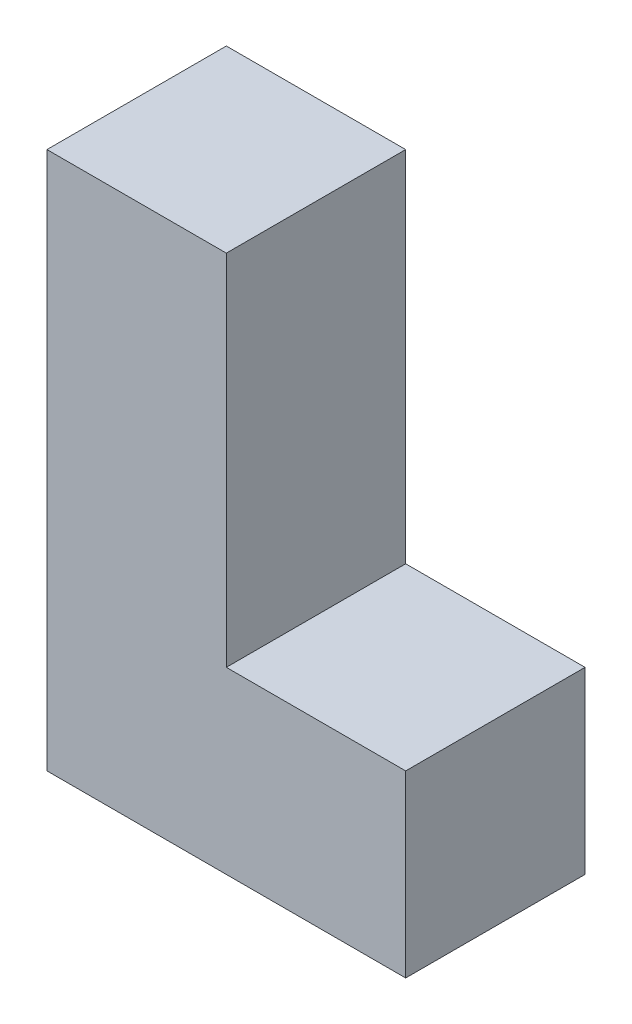
ISO-10303-21;
HEADER;
FILE_DESCRIPTION(('STEP AP214'),'2;1');
FILE_NAME('part.step','',(''),(''),'','','');
FILE_SCHEMA(('AUTOMOTIVE_DESIGN { 1 0 10303 214 1 1 1 1 }'));
ENDSEC;
DATA;
#1=APPLICATION_CONTEXT('core data for automotive mechanical design processes');
#2=APPLICATION_PROTOCOL_DEFINITION('international standard','automotive_design',2000,#1);
#3=PRODUCT_CONTEXT('',#1,'mechanical');
#4=PRODUCT('Part','Part','',(#3));
#5=PRODUCT_RELATED_PRODUCT_CATEGORY('part','',(#4));
#6=PRODUCT_DEFINITION_FORMATION('','',#4);
#7=PRODUCT_DEFINITION_CONTEXT('part definition',#1,'design');
#8=PRODUCT_DEFINITION('design','',#6,#7);
#9=PRODUCT_DEFINITION_SHAPE('','',#8);
#10=(LENGTH_UNIT() NAMED_UNIT(*) SI_UNIT(.MILLI.,.METRE.));
#11=(NAMED_UNIT(*) PLANE_ANGLE_UNIT() SI_UNIT($,.RADIAN.));
#12=(NAMED_UNIT(*) SI_UNIT($,.STERADIAN.) SOLID_ANGLE_UNIT());
#13=UNCERTAINTY_MEASURE_WITH_UNIT(LENGTH_MEASURE(1.E-05),#10,'distance_accuracy_value','');
#14=(GEOMETRIC_REPRESENTATION_CONTEXT(3) GLOBAL_UNCERTAINTY_ASSIGNED_CONTEXT((#13)) GLOBAL_UNIT_ASSIGNED_CONTEXT((#10,
#11,#12)) REPRESENTATION_CONTEXT('',''));
#15=CARTESIAN_POINT('',(0.,0.,0.));
#16=DIRECTION('',(0.,0.,1.));
#17=DIRECTION('',(1.,0.,0.));
#18=AXIS2_PLACEMENT_3D('',#15,#16,#17);
#19=CARTESIAN_POINT('',(60.,0.,30.));
#20=DIRECTION('',(0.,1.,0.));
#21=DIRECTION('',(-1.,0.,0.));
#22=AXIS2_PLACEMENT_3D('',#19,#20,#21);
#23=PLANE('',#22);
#24=DIRECTION('',(1.,0.,0.));
#25=VECTOR('',#24,1.);
#26=CARTESIAN_POINT('',(60.,0.,0.));
#27=LINE('',#26,#25);
#28=CARTESIAN_POINT('',(0.,0.,0.));
#29=VERTEX_POINT('',#28);
#30=CARTESIAN_POINT('',(60.,0.,0.));
#31=VERTEX_POINT('',#30);
#32=EDGE_CURVE('E134',#29,#31,#27,.T.);
#33=ORIENTED_EDGE('',*,*,#32,.T.);
#34=DIRECTION('',(0.,0.,-1.));
#35=VECTOR('',#34,1.);
#36=CARTESIAN_POINT('',(60.,0.,30.));
#37=LINE('',#36,#35);
#38=CARTESIAN_POINT('',(60.,0.,30.));
#39=VERTEX_POINT('',#38);
#40=EDGE_CURVE('E11',#39,#31,#37,.T.);
#41=ORIENTED_EDGE('',*,*,#40,.F.);
#42=DIRECTION('',(1.,0.,0.));
#43=VECTOR('',#42,1.);
#44=CARTESIAN_POINT('',(60.,0.,30.));
#45=LINE('',#44,#43);
#46=CARTESIAN_POINT('',(0.,0.,30.));
#47=VERTEX_POINT('',#46);
#48=EDGE_CURVE('E150',#47,#39,#45,.T.);
#49=ORIENTED_EDGE('',*,*,#48,.F.);
#50=DIRECTION('',(0.,0.,-1.));
#51=VECTOR('',#50,1.);
#52=CARTESIAN_POINT('',(0.,0.,30.));
#53=LINE('',#52,#51);
#54=EDGE_CURVE('E130',#47,#29,#53,.T.);
#55=ORIENTED_EDGE('',*,*,#54,.T.);
#56=EDGE_LOOP('',(#33,#41,#49,#55));
#57=FACE_BOUND('',#56,.T.);
#58=ADVANCED_FACE('F45',(#57),#23,.F.);
#59=CARTESIAN_POINT('',(60.,30.,30.));
#60=DIRECTION('',(-1.,0.,0.));
#61=DIRECTION('',(0.,-1.,0.));
#62=AXIS2_PLACEMENT_3D('',#59,#60,#61);
#63=PLANE('',#62);
#64=DIRECTION('',(0.,1.,0.));
#65=VECTOR('',#64,1.);
#66=CARTESIAN_POINT('',(60.,30.,0.));
#67=LINE('',#66,#65);
#68=CARTESIAN_POINT('',(60.,30.,0.));
#69=VERTEX_POINT('',#68);
#70=EDGE_CURVE('E138',#31,#69,#67,.T.);
#71=ORIENTED_EDGE('',*,*,#70,.T.);
#72=DIRECTION('',(0.,0.,-1.));
#73=VECTOR('',#72,1.);
#74=CARTESIAN_POINT('',(60.,30.,30.));
#75=LINE('',#74,#73);
#76=CARTESIAN_POINT('',(60.,30.,30.));
#77=VERTEX_POINT('',#76);
#78=EDGE_CURVE('E54',#77,#69,#75,.T.);
#79=ORIENTED_EDGE('',*,*,#78,.F.);
#80=DIRECTION('',(0.,1.,0.));
#81=VECTOR('',#80,1.);
#82=CARTESIAN_POINT('',(60.,30.,30.));
#83=LINE('',#82,#81);
#84=EDGE_CURVE('E99',#39,#77,#83,.T.);
#85=ORIENTED_EDGE('',*,*,#84,.F.);
#86=ORIENTED_EDGE('',*,*,#40,.T.);
#87=EDGE_LOOP('',(#71,#79,#85,#86));
#88=FACE_BOUND('',#87,.T.);
#89=ADVANCED_FACE('F178',(#88),#63,.F.);
#90=CARTESIAN_POINT('',(30.,30.,30.));
#91=DIRECTION('',(0.,-1.,0.));
#92=DIRECTION('',(0.,0.,-1.));
#93=AXIS2_PLACEMENT_3D('',#90,#91,#92);
#94=PLANE('',#93);
#95=DIRECTION('',(-1.,0.,0.));
#96=VECTOR('',#95,1.);
#97=CARTESIAN_POINT('',(30.,30.,0.));
#98=LINE('',#97,#96);
#99=CARTESIAN_POINT('',(30.,30.,0.));
#100=VERTEX_POINT('',#99);
#101=EDGE_CURVE('E141',#69,#100,#98,.T.);
#102=ORIENTED_EDGE('',*,*,#101,.T.);
#103=DIRECTION('',(0.,0.,-1.));
#104=VECTOR('',#103,1.);
#105=CARTESIAN_POINT('',(30.,30.,30.));
#106=LINE('',#105,#104);
#107=CARTESIAN_POINT('',(30.,30.,30.));
#108=VERTEX_POINT('',#107);
#109=EDGE_CURVE('E123',#108,#100,#106,.T.);
#110=ORIENTED_EDGE('',*,*,#109,.F.);
#111=DIRECTION('',(-1.,0.,0.));
#112=VECTOR('',#111,1.);
#113=CARTESIAN_POINT('',(30.,30.,30.));
#114=LINE('',#113,#112);
#115=EDGE_CURVE('E112',#77,#108,#114,.T.);
#116=ORIENTED_EDGE('',*,*,#115,.F.);
#117=ORIENTED_EDGE('',*,*,#78,.T.);
#118=EDGE_LOOP('',(#102,#110,#116,#117));
#119=FACE_BOUND('',#118,.T.);
#120=ADVANCED_FACE('F160',(#119),#94,.F.);
#121=CARTESIAN_POINT('',(30.,90.,30.));
#122=DIRECTION('',(-1.,0.,0.));
#123=DIRECTION('',(0.,0.,1.));
#124=AXIS2_PLACEMENT_3D('',#121,#122,#123);
#125=PLANE('',#124);
#126=DIRECTION('',(0.,1.,0.));
#127=VECTOR('',#126,1.);
#128=CARTESIAN_POINT('',(30.,90.,0.));
#129=LINE('',#128,#127);
#130=CARTESIAN_POINT('',(30.,90.,0.));
#131=VERTEX_POINT('',#130);
#132=EDGE_CURVE('E121',#100,#131,#129,.T.);
#133=ORIENTED_EDGE('',*,*,#132,.T.);
#134=DIRECTION('',(0.,0.,-1.));
#135=VECTOR('',#134,1.);
#136=CARTESIAN_POINT('',(30.,90.,30.));
#137=LINE('',#136,#135);
#138=CARTESIAN_POINT('',(30.,90.,30.));
#139=VERTEX_POINT('',#138);
#140=EDGE_CURVE('E118',#139,#131,#137,.T.);
#141=ORIENTED_EDGE('',*,*,#140,.F.);
#142=DIRECTION('',(0.,1.,0.));
#143=VECTOR('',#142,1.);
#144=CARTESIAN_POINT('',(30.,90.,30.));
#145=LINE('',#144,#143);
#146=EDGE_CURVE('E106',#108,#139,#145,.T.);
#147=ORIENTED_EDGE('',*,*,#146,.F.);
#148=ORIENTED_EDGE('',*,*,#109,.T.);
#149=EDGE_LOOP('',(#133,#141,#147,#148));
#150=FACE_BOUND('',#149,.T.);
#151=ADVANCED_FACE('F119',(#150),#125,.F.);
#152=CARTESIAN_POINT('',(0.,90.,30.));
#153=DIRECTION('',(0.,-1.,0.));
#154=DIRECTION('',(0.,0.,-1.));
#155=AXIS2_PLACEMENT_3D('',#152,#153,#154);
#156=PLANE('',#155);
#157=DIRECTION('',(-1.,0.,0.));
#158=VECTOR('',#157,1.);
#159=CARTESIAN_POINT('',(0.,90.,0.));
#160=LINE('',#159,#158);
#161=CARTESIAN_POINT('',(0.,90.,0.));
#162=VERTEX_POINT('',#161);
#163=EDGE_CURVE('E85',#131,#162,#160,.T.);
#164=ORIENTED_EDGE('',*,*,#163,.T.);
#165=DIRECTION('',(0.,0.,-1.));
#166=VECTOR('',#165,1.);
#167=CARTESIAN_POINT('',(0.,90.,30.));
#168=LINE('',#167,#166);
#169=CARTESIAN_POINT('',(0.,90.,30.));
#170=VERTEX_POINT('',#169);
#171=EDGE_CURVE('E124',#170,#162,#168,.T.);
#172=ORIENTED_EDGE('',*,*,#171,.F.);
#173=DIRECTION('',(-1.,0.,0.));
#174=VECTOR('',#173,1.);
#175=CARTESIAN_POINT('',(0.,90.,30.));
#176=LINE('',#175,#174);
#177=EDGE_CURVE('E110',#139,#170,#176,.T.);
#178=ORIENTED_EDGE('',*,*,#177,.F.);
#179=ORIENTED_EDGE('',*,*,#140,.T.);
#180=EDGE_LOOP('',(#164,#172,#178,#179));
#181=FACE_BOUND('',#180,.T.);
#182=ADVANCED_FACE('F126',(#181),#156,.F.);
#183=CARTESIAN_POINT('',(0.,0.,30.));
#184=DIRECTION('',(1.,0.,0.));
#185=DIRECTION('',(0.,0.,-1.));
#186=AXIS2_PLACEMENT_3D('',#183,#184,#185);
#187=PLANE('',#186);
#188=DIRECTION('',(0.,-1.,0.));
#189=VECTOR('',#188,1.);
#190=CARTESIAN_POINT('',(0.,0.,0.));
#191=LINE('',#190,#189);
#192=EDGE_CURVE('E91',#162,#29,#191,.T.);
#193=ORIENTED_EDGE('',*,*,#192,.T.);
#194=ORIENTED_EDGE('',*,*,#54,.F.);
#195=DIRECTION('',(0.,-1.,0.));
#196=VECTOR('',#195,1.);
#197=CARTESIAN_POINT('',(0.,0.,30.));
#198=LINE('',#197,#196);
#199=EDGE_CURVE('E62',#170,#47,#198,.T.);
#200=ORIENTED_EDGE('',*,*,#199,.F.);
#201=ORIENTED_EDGE('',*,*,#171,.T.);
#202=EDGE_LOOP('',(#193,#194,#200,#201));
#203=FACE_BOUND('',#202,.T.);
#204=ADVANCED_FACE('F167',(#203),#187,.F.);
#205=CARTESIAN_POINT('',(0.,0.,30.));
#206=DIRECTION('',(0.,0.,-1.));
#207=DIRECTION('',(-1.,0.,0.));
#208=AXIS2_PLACEMENT_3D('',#205,#206,#207);
#209=PLANE('',#208);
#210=ORIENTED_EDGE('',*,*,#48,.T.);
#211=ORIENTED_EDGE('',*,*,#84,.T.);
#212=ORIENTED_EDGE('',*,*,#115,.T.);
#213=ORIENTED_EDGE('',*,*,#146,.T.);
#214=ORIENTED_EDGE('',*,*,#177,.T.);
#215=ORIENTED_EDGE('',*,*,#199,.T.);
#216=EDGE_LOOP('',(#210,#211,#212,#213,#214,#215));
#217=FACE_BOUND('',#216,.T.);
#218=ADVANCED_FACE('F108',(#217),#209,.F.);
#219=CARTESIAN_POINT('',(0.,0.,0.));
#220=DIRECTION('',(0.,0.,-1.));
#221=DIRECTION('',(-1.,0.,0.));
#222=AXIS2_PLACEMENT_3D('',#219,#220,#221);
#223=PLANE('',#222);
#224=ORIENTED_EDGE('',*,*,#32,.F.);
#225=ORIENTED_EDGE('',*,*,#192,.F.);
#226=ORIENTED_EDGE('',*,*,#163,.F.);
#227=ORIENTED_EDGE('',*,*,#132,.F.);
#228=ORIENTED_EDGE('',*,*,#101,.F.);
#229=ORIENTED_EDGE('',*,*,#70,.F.);
#230=EDGE_LOOP('',(#224,#225,#226,#227,#228,#229));
#231=FACE_BOUND('',#230,.T.);
#232=ADVANCED_FACE('F163',(#231),#223,.T.);
#233=CLOSED_SHELL('',(#58,#89,#120,#151,#182,#204,#218,#232));
#234=MANIFOLD_SOLID_BREP('B2',#233);
#235=ADVANCED_BREP_SHAPE_REPRESENTATION('',(#18,#234),#14);
#236=SHAPE_DEFINITION_REPRESENTATION(#9,#235);
ENDSEC;
END-ISO-10303-21;
